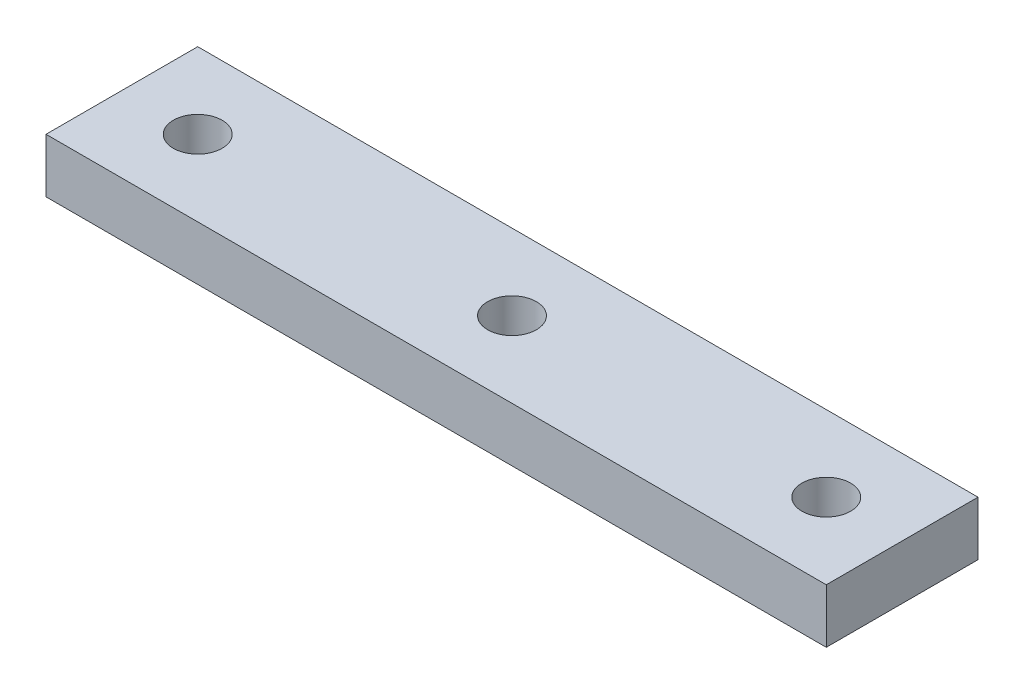
ISO-10303-21;
HEADER;
FILE_DESCRIPTION(('STEP AP214'),'2;1');
FILE_NAME('part.step','',(''),(''),'','','');
FILE_SCHEMA(('AUTOMOTIVE_DESIGN { 1 0 10303 214 1 1 1 1 }'));
ENDSEC;
DATA;
#1=APPLICATION_CONTEXT('core data for automotive mechanical design processes');
#2=APPLICATION_PROTOCOL_DEFINITION('international standard','automotive_design',2000,#1);
#3=PRODUCT_CONTEXT('',#1,'mechanical');
#4=PRODUCT('Part','Part','',(#3));
#5=PRODUCT_RELATED_PRODUCT_CATEGORY('part','',(#4));
#6=PRODUCT_DEFINITION_FORMATION('','',#4);
#7=PRODUCT_DEFINITION_CONTEXT('part definition',#1,'design');
#8=PRODUCT_DEFINITION('design','',#6,#7);
#9=PRODUCT_DEFINITION_SHAPE('','',#8);
#10=(LENGTH_UNIT() NAMED_UNIT(*) SI_UNIT(.MILLI.,.METRE.));
#11=(NAMED_UNIT(*) PLANE_ANGLE_UNIT() SI_UNIT($,.RADIAN.));
#12=(NAMED_UNIT(*) SI_UNIT($,.STERADIAN.) SOLID_ANGLE_UNIT());
#13=UNCERTAINTY_MEASURE_WITH_UNIT(LENGTH_MEASURE(1.E-05),#10,'distance_accuracy_value','');
#14=(GEOMETRIC_REPRESENTATION_CONTEXT(3) GLOBAL_UNCERTAINTY_ASSIGNED_CONTEXT((#13)) GLOBAL_UNIT_ASSIGNED_CONTEXT((#10,
#11,#12)) REPRESENTATION_CONTEXT('',''));
#15=CARTESIAN_POINT('',(0.,0.,0.));
#16=DIRECTION('',(0.,0.,1.));
#17=DIRECTION('',(1.,0.,0.));
#18=AXIS2_PLACEMENT_3D('',#15,#16,#17);
#19=CARTESIAN_POINT('',(0.,5.,0.));
#20=DIRECTION('',(0.,1.,0.));
#21=DIRECTION('',(0.,0.,1.));
#22=AXIS2_PLACEMENT_3D('',#19,#20,#21);
#23=PLANE('',#22);
#24=CARTESIAN_POINT('',(29.,5.,0.));
#25=DIRECTION('',(0.,1.,0.));
#26=DIRECTION('',(0.,0.,1.));
#27=AXIS2_PLACEMENT_3D('',#24,#25,#26);
#28=CIRCLE('',#27,2.25);
#29=CARTESIAN_POINT('',(29.,5.,2.25000000000001));
#30=VERTEX_POINT('',#29);
#31=EDGE_CURVE('E118',#30,#30,#28,.T.);
#32=ORIENTED_EDGE('',*,*,#31,.F.);
#33=EDGE_LOOP('',(#32));
#34=FACE_BOUND('',#33,.T.);
#35=DIRECTION('',(0.,0.,-1.));
#36=VECTOR('',#35,1.);
#37=CARTESIAN_POINT('',(36.,5.,-7.));
#38=LINE('',#37,#36);
#39=CARTESIAN_POINT('',(36.,5.,7.));
#40=VERTEX_POINT('',#39);
#41=CARTESIAN_POINT('',(36.,5.,-7.));
#42=VERTEX_POINT('',#41);
#43=EDGE_CURVE('E88',#40,#42,#38,.T.);
#44=ORIENTED_EDGE('',*,*,#43,.T.);
#45=DIRECTION('',(-1.,0.,0.));
#46=VECTOR('',#45,1.);
#47=CARTESIAN_POINT('',(-36.,5.,-7.));
#48=LINE('',#47,#46);
#49=CARTESIAN_POINT('',(-36.,5.,-7.));
#50=VERTEX_POINT('',#49);
#51=EDGE_CURVE('E83',#42,#50,#48,.T.);
#52=ORIENTED_EDGE('',*,*,#51,.T.);
#53=DIRECTION('',(0.,0.,1.));
#54=VECTOR('',#53,1.);
#55=CARTESIAN_POINT('',(-36.,5.,-7.));
#56=LINE('',#55,#54);
#57=CARTESIAN_POINT('',(-36.,5.,7.));
#58=VERTEX_POINT('',#57);
#59=EDGE_CURVE('E86',#50,#58,#56,.T.);
#60=ORIENTED_EDGE('',*,*,#59,.T.);
#61=DIRECTION('',(1.,0.,0.));
#62=VECTOR('',#61,1.);
#63=CARTESIAN_POINT('',(-36.,5.,7.));
#64=LINE('',#63,#62);
#65=EDGE_CURVE('E53',#58,#40,#64,.T.);
#66=ORIENTED_EDGE('',*,*,#65,.T.);
#67=EDGE_LOOP('',(#44,#52,#60,#66));
#68=FACE_BOUND('',#67,.T.);
#69=CARTESIAN_POINT('',(0.,5.,0.));
#70=DIRECTION('',(0.,1.,0.));
#71=DIRECTION('',(0.,0.,1.));
#72=AXIS2_PLACEMENT_3D('',#69,#70,#71);
#73=CIRCLE('',#72,2.25);
#74=CARTESIAN_POINT('',(0.,5.,2.25));
#75=VERTEX_POINT('',#74);
#76=EDGE_CURVE('E103',#75,#75,#73,.T.);
#77=ORIENTED_EDGE('',*,*,#76,.F.);
#78=EDGE_LOOP('',(#77));
#79=FACE_BOUND('',#78,.T.);
#80=CARTESIAN_POINT('',(-29.,5.,0.));
#81=DIRECTION('',(0.,1.,0.));
#82=DIRECTION('',(0.,0.,1.));
#83=AXIS2_PLACEMENT_3D('',#80,#81,#82);
#84=CIRCLE('',#83,2.25);
#85=CARTESIAN_POINT('',(-29.,5.,2.25000000000001));
#86=VERTEX_POINT('',#85);
#87=EDGE_CURVE('E124',#86,#86,#84,.T.);
#88=ORIENTED_EDGE('',*,*,#87,.F.);
#89=EDGE_LOOP('',(#88));
#90=FACE_BOUND('',#89,.T.);
#91=ADVANCED_FACE('F36',(#34,#68,#79,#90),#23,.T.);
#92=CARTESIAN_POINT('',(0.,0.,0.));
#93=DIRECTION('',(0.,1.,0.));
#94=DIRECTION('',(0.,0.,1.));
#95=AXIS2_PLACEMENT_3D('',#92,#93,#94);
#96=PLANE('',#95);
#97=DIRECTION('',(0.,0.,-1.));
#98=VECTOR('',#97,1.);
#99=CARTESIAN_POINT('',(36.,0.,-7.));
#100=LINE('',#99,#98);
#101=CARTESIAN_POINT('',(36.,0.,7.));
#102=VERTEX_POINT('',#101);
#103=CARTESIAN_POINT('',(36.,0.,-7.));
#104=VERTEX_POINT('',#103);
#105=EDGE_CURVE('E100',#102,#104,#100,.T.);
#106=ORIENTED_EDGE('',*,*,#105,.F.);
#107=DIRECTION('',(1.,0.,0.));
#108=VECTOR('',#107,1.);
#109=CARTESIAN_POINT('',(-36.,0.,7.));
#110=LINE('',#109,#108);
#111=CARTESIAN_POINT('',(-36.,0.,7.));
#112=VERTEX_POINT('',#111);
#113=EDGE_CURVE('E76',#112,#102,#110,.T.);
#114=ORIENTED_EDGE('',*,*,#113,.F.);
#115=DIRECTION('',(0.,0.,1.));
#116=VECTOR('',#115,1.);
#117=CARTESIAN_POINT('',(-36.,0.,-7.));
#118=LINE('',#117,#116);
#119=CARTESIAN_POINT('',(-36.,0.,-7.));
#120=VERTEX_POINT('',#119);
#121=EDGE_CURVE('E70',#120,#112,#118,.T.);
#122=ORIENTED_EDGE('',*,*,#121,.F.);
#123=DIRECTION('',(-1.,0.,0.));
#124=VECTOR('',#123,1.);
#125=CARTESIAN_POINT('',(-36.,0.,-7.));
#126=LINE('',#125,#124);
#127=EDGE_CURVE('E92',#104,#120,#126,.T.);
#128=ORIENTED_EDGE('',*,*,#127,.F.);
#129=EDGE_LOOP('',(#106,#114,#122,#128));
#130=FACE_BOUND('',#129,.T.);
#131=CARTESIAN_POINT('',(0.,0.,0.));
#132=DIRECTION('',(0.,1.,0.));
#133=DIRECTION('',(0.,0.,1.));
#134=AXIS2_PLACEMENT_3D('',#131,#132,#133);
#135=CIRCLE('',#134,2.25);
#136=CARTESIAN_POINT('',(0.,0.,2.25));
#137=VERTEX_POINT('',#136);
#138=EDGE_CURVE('E115',#137,#137,#135,.T.);
#139=ORIENTED_EDGE('',*,*,#138,.T.);
#140=EDGE_LOOP('',(#139));
#141=FACE_BOUND('',#140,.T.);
#142=CARTESIAN_POINT('',(29.,0.,0.));
#143=DIRECTION('',(0.,1.,0.));
#144=DIRECTION('',(0.,0.,1.));
#145=AXIS2_PLACEMENT_3D('',#142,#143,#144);
#146=CIRCLE('',#145,2.25);
#147=CARTESIAN_POINT('',(29.,0.,2.25000000000001));
#148=VERTEX_POINT('',#147);
#149=EDGE_CURVE('E121',#148,#148,#146,.T.);
#150=ORIENTED_EDGE('',*,*,#149,.T.);
#151=EDGE_LOOP('',(#150));
#152=FACE_BOUND('',#151,.T.);
#153=CARTESIAN_POINT('',(-29.,0.,0.));
#154=DIRECTION('',(0.,1.,0.));
#155=DIRECTION('',(0.,0.,1.));
#156=AXIS2_PLACEMENT_3D('',#153,#154,#155);
#157=CIRCLE('',#156,2.25);
#158=CARTESIAN_POINT('',(-29.,0.,2.25000000000001));
#159=VERTEX_POINT('',#158);
#160=EDGE_CURVE('E127',#159,#159,#157,.T.);
#161=ORIENTED_EDGE('',*,*,#160,.T.);
#162=EDGE_LOOP('',(#161));
#163=FACE_BOUND('',#162,.T.);
#164=ADVANCED_FACE('F111',(#130,#141,#152,#163),#96,.F.);
#165=CARTESIAN_POINT('',(36.,5.,-7.));
#166=DIRECTION('',(-1.,0.,0.));
#167=DIRECTION('',(0.,0.,1.));
#168=AXIS2_PLACEMENT_3D('',#165,#166,#167);
#169=PLANE('',#168);
#170=ORIENTED_EDGE('',*,*,#105,.T.);
#171=DIRECTION('',(0.,-1.,0.));
#172=VECTOR('',#171,1.);
#173=CARTESIAN_POINT('',(36.,5.,-7.));
#174=LINE('',#173,#172);
#175=EDGE_CURVE('E11',#42,#104,#174,.T.);
#176=ORIENTED_EDGE('',*,*,#175,.F.);
#177=ORIENTED_EDGE('',*,*,#43,.F.);
#178=DIRECTION('',(0.,-1.,0.));
#179=VECTOR('',#178,1.);
#180=CARTESIAN_POINT('',(36.,5.,7.));
#181=LINE('',#180,#179);
#182=EDGE_CURVE('E96',#40,#102,#181,.T.);
#183=ORIENTED_EDGE('',*,*,#182,.T.);
#184=EDGE_LOOP('',(#170,#176,#177,#183));
#185=FACE_BOUND('',#184,.T.);
#186=ADVANCED_FACE('F38',(#185),#169,.F.);
#187=CARTESIAN_POINT('',(-36.,5.,-7.));
#188=DIRECTION('',(0.,0.,1.));
#189=DIRECTION('',(1.,0.,0.));
#190=AXIS2_PLACEMENT_3D('',#187,#188,#189);
#191=PLANE('',#190);
#192=ORIENTED_EDGE('',*,*,#127,.T.);
#193=DIRECTION('',(0.,-1.,0.));
#194=VECTOR('',#193,1.);
#195=CARTESIAN_POINT('',(-36.,5.,-7.));
#196=LINE('',#195,#194);
#197=EDGE_CURVE('E45',#50,#120,#196,.T.);
#198=ORIENTED_EDGE('',*,*,#197,.F.);
#199=ORIENTED_EDGE('',*,*,#51,.F.);
#200=ORIENTED_EDGE('',*,*,#175,.T.);
#201=EDGE_LOOP('',(#192,#198,#199,#200));
#202=FACE_BOUND('',#201,.T.);
#203=ADVANCED_FACE('F91',(#202),#191,.F.);
#204=CARTESIAN_POINT('',(-36.,5.,-7.));
#205=DIRECTION('',(1.,0.,0.));
#206=DIRECTION('',(0.,0.,-1.));
#207=AXIS2_PLACEMENT_3D('',#204,#205,#206);
#208=PLANE('',#207);
#209=ORIENTED_EDGE('',*,*,#121,.T.);
#210=DIRECTION('',(0.,-1.,0.));
#211=VECTOR('',#210,1.);
#212=CARTESIAN_POINT('',(-36.,5.,7.));
#213=LINE('',#212,#211);
#214=EDGE_CURVE('E93',#58,#112,#213,.T.);
#215=ORIENTED_EDGE('',*,*,#214,.F.);
#216=ORIENTED_EDGE('',*,*,#59,.F.);
#217=ORIENTED_EDGE('',*,*,#197,.T.);
#218=EDGE_LOOP('',(#209,#215,#216,#217));
#219=FACE_BOUND('',#218,.T.);
#220=ADVANCED_FACE('F94',(#219),#208,.F.);
#221=CARTESIAN_POINT('',(-36.,5.,7.));
#222=DIRECTION('',(0.,0.,-1.));
#223=DIRECTION('',(-1.,0.,0.));
#224=AXIS2_PLACEMENT_3D('',#221,#222,#223);
#225=PLANE('',#224);
#226=ORIENTED_EDGE('',*,*,#113,.T.);
#227=ORIENTED_EDGE('',*,*,#182,.F.);
#228=ORIENTED_EDGE('',*,*,#65,.F.);
#229=ORIENTED_EDGE('',*,*,#214,.T.);
#230=EDGE_LOOP('',(#226,#227,#228,#229));
#231=FACE_BOUND('',#230,.T.);
#232=ADVANCED_FACE('F108',(#231),#225,.F.);
#233=CARTESIAN_POINT('',(0.,5.,0.));
#234=DIRECTION('',(0.,-1.,0.));
#235=DIRECTION('',(0.,0.,-1.));
#236=AXIS2_PLACEMENT_3D('',#233,#234,#235);
#237=CYLINDRICAL_SURFACE('',#236,2.25);
#238=ORIENTED_EDGE('',*,*,#76,.T.);
#239=EDGE_LOOP('',(#238));
#240=FACE_BOUND('',#239,.T.);
#241=ORIENTED_EDGE('',*,*,#138,.F.);
#242=EDGE_LOOP('',(#241));
#243=FACE_BOUND('',#242,.T.);
#244=ADVANCED_FACE('F145',(#240,#243),#237,.F.);
#245=CARTESIAN_POINT('',(29.,5.,0.));
#246=DIRECTION('',(0.,-1.,0.));
#247=DIRECTION('',(0.,0.,-1.));
#248=AXIS2_PLACEMENT_3D('',#245,#246,#247);
#249=CYLINDRICAL_SURFACE('',#248,2.25);
#250=ORIENTED_EDGE('',*,*,#31,.T.);
#251=EDGE_LOOP('',(#250));
#252=FACE_BOUND('',#251,.T.);
#253=ORIENTED_EDGE('',*,*,#149,.F.);
#254=EDGE_LOOP('',(#253));
#255=FACE_BOUND('',#254,.T.);
#256=ADVANCED_FACE('F191',(#252,#255),#249,.F.);
#257=CARTESIAN_POINT('',(-29.,5.,0.));
#258=DIRECTION('',(0.,-1.,0.));
#259=DIRECTION('',(0.,0.,-1.));
#260=AXIS2_PLACEMENT_3D('',#257,#258,#259);
#261=CYLINDRICAL_SURFACE('',#260,2.25);
#262=ORIENTED_EDGE('',*,*,#87,.T.);
#263=EDGE_LOOP('',(#262));
#264=FACE_BOUND('',#263,.T.);
#265=ORIENTED_EDGE('',*,*,#160,.F.);
#266=EDGE_LOOP('',(#265));
#267=FACE_BOUND('',#266,.T.);
#268=ADVANCED_FACE('F133',(#264,#267),#261,.F.);
#269=CLOSED_SHELL('',(#91,#164,#186,#203,#220,#232,#244,#256,#268));
#270=MANIFOLD_SOLID_BREP('B2',#269);
#271=ADVANCED_BREP_SHAPE_REPRESENTATION('',(#18,#270),#14);
#272=SHAPE_DEFINITION_REPRESENTATION(#9,#271);
ENDSEC;
END-ISO-10303-21;
